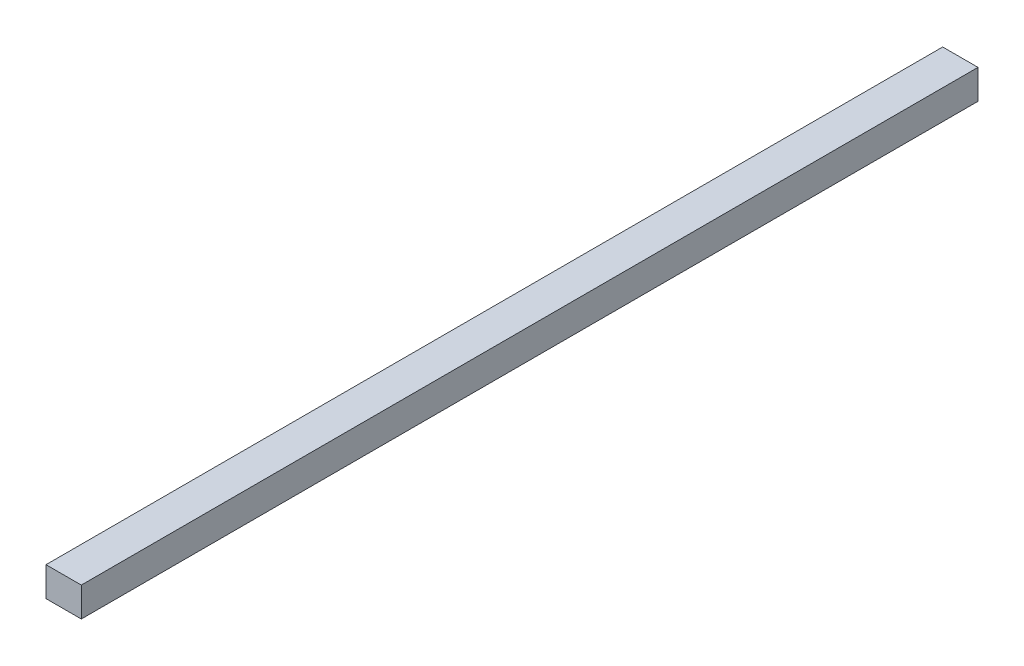
ISO-10303-21;
HEADER;
FILE_DESCRIPTION(('STEP AP214'),'2;1');
FILE_NAME('part.step','',(''),(''),'','','');
FILE_SCHEMA(('AUTOMOTIVE_DESIGN { 1 0 10303 214 1 1 1 1 }'));
ENDSEC;
DATA;
#1=APPLICATION_CONTEXT('core data for automotive mechanical design processes');
#2=APPLICATION_PROTOCOL_DEFINITION('international standard','automotive_design',2000,#1);
#3=PRODUCT_CONTEXT('',#1,'mechanical');
#4=PRODUCT('Part','Part','',(#3));
#5=PRODUCT_RELATED_PRODUCT_CATEGORY('part','',(#4));
#6=PRODUCT_DEFINITION_FORMATION('','',#4);
#7=PRODUCT_DEFINITION_CONTEXT('part definition',#1,'design');
#8=PRODUCT_DEFINITION('design','',#6,#7);
#9=PRODUCT_DEFINITION_SHAPE('','',#8);
#10=(LENGTH_UNIT() NAMED_UNIT(*) SI_UNIT(.MILLI.,.METRE.));
#11=(NAMED_UNIT(*) PLANE_ANGLE_UNIT() SI_UNIT($,.RADIAN.));
#12=(NAMED_UNIT(*) SI_UNIT($,.STERADIAN.) SOLID_ANGLE_UNIT());
#13=UNCERTAINTY_MEASURE_WITH_UNIT(LENGTH_MEASURE(1.E-05),#10,'distance_accuracy_value','');
#14=(GEOMETRIC_REPRESENTATION_CONTEXT(3) GLOBAL_UNCERTAINTY_ASSIGNED_CONTEXT((#13)) GLOBAL_UNIT_ASSIGNED_CONTEXT((#10,
#11,#12)) REPRESENTATION_CONTEXT('',''));
#15=CARTESIAN_POINT('',(0.,0.,0.));
#16=DIRECTION('',(0.,0.,1.));
#17=DIRECTION('',(1.,0.,0.));
#18=AXIS2_PLACEMENT_3D('',#15,#16,#17);
#19=CARTESIAN_POINT('',(-5.99999999999999,-5.,152.4));
#20=DIRECTION('',(1.,0.,0.));
#21=DIRECTION('',(0.,1.,0.));
#22=AXIS2_PLACEMENT_3D('',#19,#20,#21);
#23=PLANE('',#22);
#24=DIRECTION('',(0.,-1.,0.));
#25=VECTOR('',#24,1.);
#26=CARTESIAN_POINT('',(-5.99999999999999,-5.,-152.4));
#27=LINE('',#26,#25);
#28=CARTESIAN_POINT('',(-6.,5.,-152.4));
#29=VERTEX_POINT('',#28);
#30=CARTESIAN_POINT('',(-5.99999999999999,-5.,-152.4));
#31=VERTEX_POINT('',#30);
#32=EDGE_CURVE('E97',#29,#31,#27,.T.);
#33=ORIENTED_EDGE('',*,*,#32,.T.);
#34=DIRECTION('',(0.,0.,-1.));
#35=VECTOR('',#34,1.);
#36=CARTESIAN_POINT('',(-5.99999999999999,-5.,152.4));
#37=LINE('',#36,#35);
#38=CARTESIAN_POINT('',(-5.99999999999999,-5.,152.4));
#39=VERTEX_POINT('',#38);
#40=EDGE_CURVE('E11',#39,#31,#37,.T.);
#41=ORIENTED_EDGE('',*,*,#40,.F.);
#42=DIRECTION('',(0.,-1.,0.));
#43=VECTOR('',#42,1.);
#44=CARTESIAN_POINT('',(-5.99999999999999,-5.,152.4));
#45=LINE('',#44,#43);
#46=CARTESIAN_POINT('',(-6.,5.,152.4));
#47=VERTEX_POINT('',#46);
#48=EDGE_CURVE('E85',#47,#39,#45,.T.);
#49=ORIENTED_EDGE('',*,*,#48,.F.);
#50=DIRECTION('',(0.,0.,-1.));
#51=VECTOR('',#50,1.);
#52=CARTESIAN_POINT('',(-6.,5.,152.4));
#53=LINE('',#52,#51);
#54=EDGE_CURVE('E93',#47,#29,#53,.T.);
#55=ORIENTED_EDGE('',*,*,#54,.T.);
#56=EDGE_LOOP('',(#33,#41,#49,#55));
#57=FACE_BOUND('',#56,.T.);
#58=ADVANCED_FACE('F34',(#57),#23,.F.);
#59=CARTESIAN_POINT('',(6.,-5.,152.4));
#60=DIRECTION('',(0.,1.,0.));
#61=DIRECTION('',(-1.,0.,0.));
#62=AXIS2_PLACEMENT_3D('',#59,#60,#61);
#63=PLANE('',#62);
#64=DIRECTION('',(1.,0.,0.));
#65=VECTOR('',#64,1.);
#66=CARTESIAN_POINT('',(6.,-5.,-152.4));
#67=LINE('',#66,#65);
#68=CARTESIAN_POINT('',(6.,-5.,-152.4));
#69=VERTEX_POINT('',#68);
#70=EDGE_CURVE('E89',#31,#69,#67,.T.);
#71=ORIENTED_EDGE('',*,*,#70,.T.);
#72=DIRECTION('',(0.,0.,-1.));
#73=VECTOR('',#72,1.);
#74=CARTESIAN_POINT('',(6.,-5.,152.4));
#75=LINE('',#74,#73);
#76=CARTESIAN_POINT('',(6.,-5.,152.4));
#77=VERTEX_POINT('',#76);
#78=EDGE_CURVE('E42',#77,#69,#75,.T.);
#79=ORIENTED_EDGE('',*,*,#78,.F.);
#80=DIRECTION('',(1.,0.,0.));
#81=VECTOR('',#80,1.);
#82=CARTESIAN_POINT('',(6.,-5.,152.4));
#83=LINE('',#82,#81);
#84=EDGE_CURVE('E80',#39,#77,#83,.T.);
#85=ORIENTED_EDGE('',*,*,#84,.F.);
#86=ORIENTED_EDGE('',*,*,#40,.T.);
#87=EDGE_LOOP('',(#71,#79,#85,#86));
#88=FACE_BOUND('',#87,.T.);
#89=ADVANCED_FACE('F88',(#88),#63,.F.);
#90=CARTESIAN_POINT('',(6.,5.,152.4));
#91=DIRECTION('',(-1.,0.,0.));
#92=DIRECTION('',(0.,0.,1.));
#93=AXIS2_PLACEMENT_3D('',#90,#91,#92);
#94=PLANE('',#93);
#95=DIRECTION('',(0.,1.,0.));
#96=VECTOR('',#95,1.);
#97=CARTESIAN_POINT('',(6.,5.,-152.4));
#98=LINE('',#97,#96);
#99=CARTESIAN_POINT('',(6.,5.,-152.4));
#100=VERTEX_POINT('',#99);
#101=EDGE_CURVE('E67',#69,#100,#98,.T.);
#102=ORIENTED_EDGE('',*,*,#101,.T.);
#103=DIRECTION('',(0.,0.,-1.));
#104=VECTOR('',#103,1.);
#105=CARTESIAN_POINT('',(6.,5.,152.4));
#106=LINE('',#105,#104);
#107=CARTESIAN_POINT('',(6.,5.,152.4));
#108=VERTEX_POINT('',#107);
#109=EDGE_CURVE('E90',#108,#100,#106,.T.);
#110=ORIENTED_EDGE('',*,*,#109,.F.);
#111=DIRECTION('',(0.,1.,0.));
#112=VECTOR('',#111,1.);
#113=CARTESIAN_POINT('',(6.,5.,152.4));
#114=LINE('',#113,#112);
#115=EDGE_CURVE('E83',#77,#108,#114,.T.);
#116=ORIENTED_EDGE('',*,*,#115,.F.);
#117=ORIENTED_EDGE('',*,*,#78,.T.);
#118=EDGE_LOOP('',(#102,#110,#116,#117));
#119=FACE_BOUND('',#118,.T.);
#120=ADVANCED_FACE('F91',(#119),#94,.F.);
#121=CARTESIAN_POINT('',(-6.,5.,152.4));
#122=DIRECTION('',(0.,-1.,0.));
#123=DIRECTION('',(1.,0.,0.));
#124=AXIS2_PLACEMENT_3D('',#121,#122,#123);
#125=PLANE('',#124);
#126=DIRECTION('',(-1.,0.,0.));
#127=VECTOR('',#126,1.);
#128=CARTESIAN_POINT('',(-6.,5.,-152.4));
#129=LINE('',#128,#127);
#130=EDGE_CURVE('E73',#100,#29,#129,.T.);
#131=ORIENTED_EDGE('',*,*,#130,.T.);
#132=ORIENTED_EDGE('',*,*,#54,.F.);
#133=DIRECTION('',(-1.,0.,0.));
#134=VECTOR('',#133,1.);
#135=CARTESIAN_POINT('',(-6.,5.,152.4));
#136=LINE('',#135,#134);
#137=EDGE_CURVE('E50',#108,#47,#136,.T.);
#138=ORIENTED_EDGE('',*,*,#137,.F.);
#139=ORIENTED_EDGE('',*,*,#109,.T.);
#140=EDGE_LOOP('',(#131,#132,#138,#139));
#141=FACE_BOUND('',#140,.T.);
#142=ADVANCED_FACE('F104',(#141),#125,.F.);
#143=CARTESIAN_POINT('',(0.,0.,152.4));
#144=DIRECTION('',(0.,0.,-1.));
#145=DIRECTION('',(-1.,0.,0.));
#146=AXIS2_PLACEMENT_3D('',#143,#144,#145);
#147=PLANE('',#146);
#148=ORIENTED_EDGE('',*,*,#48,.T.);
#149=ORIENTED_EDGE('',*,*,#84,.T.);
#150=ORIENTED_EDGE('',*,*,#115,.T.);
#151=ORIENTED_EDGE('',*,*,#137,.T.);
#152=EDGE_LOOP('',(#148,#149,#150,#151));
#153=FACE_BOUND('',#152,.T.);
#154=ADVANCED_FACE('F81',(#153),#147,.F.);
#155=CARTESIAN_POINT('',(0.,0.,-152.4));
#156=DIRECTION('',(0.,0.,-1.));
#157=DIRECTION('',(-1.,0.,0.));
#158=AXIS2_PLACEMENT_3D('',#155,#156,#157);
#159=PLANE('',#158);
#160=ORIENTED_EDGE('',*,*,#32,.F.);
#161=ORIENTED_EDGE('',*,*,#130,.F.);
#162=ORIENTED_EDGE('',*,*,#101,.F.);
#163=ORIENTED_EDGE('',*,*,#70,.F.);
#164=EDGE_LOOP('',(#160,#161,#162,#163));
#165=FACE_BOUND('',#164,.T.);
#166=ADVANCED_FACE('F107',(#165),#159,.T.);
#167=CLOSED_SHELL('',(#58,#89,#120,#142,#154,#166));
#168=MANIFOLD_SOLID_BREP('B2',#167);
#169=ADVANCED_BREP_SHAPE_REPRESENTATION('',(#18,#168),#14);
#170=SHAPE_DEFINITION_REPRESENTATION(#9,#169);
ENDSEC;
END-ISO-10303-21;
